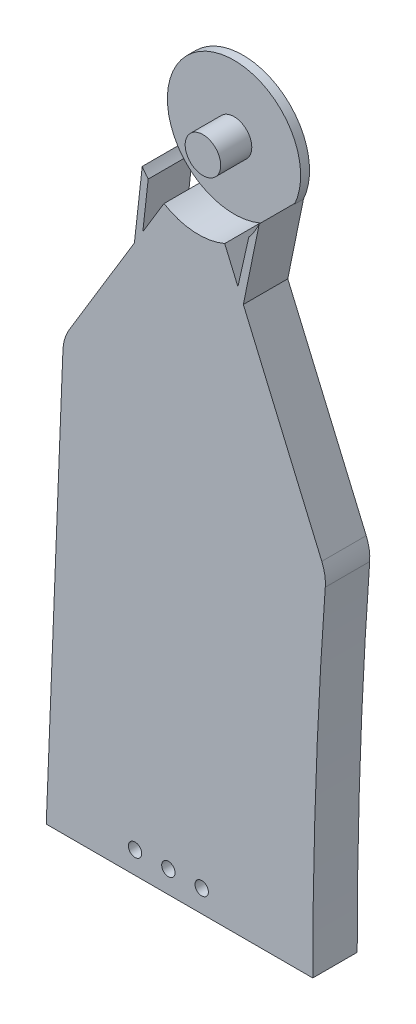
ISO-10303-21;
HEADER;
FILE_DESCRIPTION(('STEP AP214'),'2;1');
FILE_NAME('part.step','',(''),(''),'','','');
FILE_SCHEMA(('AUTOMOTIVE_DESIGN { 1 0 10303 214 1 1 1 1 }'));
ENDSEC;
DATA;
#1=APPLICATION_CONTEXT('core data for automotive mechanical design processes');
#2=APPLICATION_PROTOCOL_DEFINITION('international standard','automotive_design',2000,#1);
#3=PRODUCT_CONTEXT('',#1,'mechanical');
#4=PRODUCT('Part','Part','',(#3));
#5=PRODUCT_RELATED_PRODUCT_CATEGORY('part','',(#4));
#6=PRODUCT_DEFINITION_FORMATION('','',#4);
#7=PRODUCT_DEFINITION_CONTEXT('part definition',#1,'design');
#8=PRODUCT_DEFINITION('design','',#6,#7);
#9=PRODUCT_DEFINITION_SHAPE('','',#8);
#10=(LENGTH_UNIT() NAMED_UNIT(*) SI_UNIT(.MILLI.,.METRE.));
#11=(NAMED_UNIT(*) PLANE_ANGLE_UNIT() SI_UNIT($,.RADIAN.));
#12=(NAMED_UNIT(*) SI_UNIT($,.STERADIAN.) SOLID_ANGLE_UNIT());
#13=UNCERTAINTY_MEASURE_WITH_UNIT(LENGTH_MEASURE(1.E-05),#10,'distance_accuracy_value','');
#14=(GEOMETRIC_REPRESENTATION_CONTEXT(3) GLOBAL_UNCERTAINTY_ASSIGNED_CONTEXT((#13)) GLOBAL_UNIT_ASSIGNED_CONTEXT((#10,
#11,#12)) REPRESENTATION_CONTEXT('',''));
#15=CARTESIAN_POINT('',(0.,0.,0.));
#16=DIRECTION('',(0.,0.,1.));
#17=DIRECTION('',(1.,0.,0.));
#18=AXIS2_PLACEMENT_3D('',#15,#16,#17);
#19=CARTESIAN_POINT('',(44.2763644931734,147.051943440715,2.));
#20=DIRECTION('',(0.,0.,-1.));
#21=DIRECTION('',(-1.,0.,0.));
#22=AXIS2_PLACEMENT_3D('',#19,#20,#21);
#23=CYLINDRICAL_SURFACE('',#22,15.);
#24=DIRECTION('',(0.,0.,-1.));
#25=VECTOR('',#24,1.);
#26=CARTESIAN_POINT('',(31.6125575888967,139.012789586534,10.));
#27=LINE('',#26,#25);
#28=CARTESIAN_POINT('',(31.6125575888967,139.012789586534,2.));
#29=VERTEX_POINT('',#28);
#30=CARTESIAN_POINT('',(31.6125575888967,139.012789586534,0.));
#31=VERTEX_POINT('',#30);
#32=EDGE_CURVE('E236',#29,#31,#27,.T.);
#33=ORIENTED_EDGE('',*,*,#32,.F.);
#34=CARTESIAN_POINT('',(44.2763644931734,147.051943440715,2.));
#35=DIRECTION('',(0.,0.,-1.));
#36=DIRECTION('',(-1.,0.,0.));
#37=AXIS2_PLACEMENT_3D('',#34,#35,#36);
#38=CIRCLE('',#37,15.);
#39=CARTESIAN_POINT('',(57.9090395867184,140.794933788027,2.));
#40=VERTEX_POINT('',#39);
#41=EDGE_CURVE('E391',#29,#40,#38,.T.);
#42=ORIENTED_EDGE('',*,*,#41,.T.);
#43=DIRECTION('',(0.,0.,-1.));
#44=VECTOR('',#43,1.);
#45=CARTESIAN_POINT('',(57.9090395867184,140.794933788027,2.));
#46=LINE('',#45,#44);
#47=CARTESIAN_POINT('',(57.9090395867184,140.794933788027,0.));
#48=VERTEX_POINT('',#47);
#49=EDGE_CURVE('E381',#48,#40,#46,.F.);
#50=ORIENTED_EDGE('',*,*,#49,.F.);
#51=CARTESIAN_POINT('',(44.2763644931734,147.051943440715,0.));
#52=DIRECTION('',(0.,0.,-1.));
#53=DIRECTION('',(-1.,0.,0.));
#54=AXIS2_PLACEMENT_3D('',#51,#52,#53);
#55=CIRCLE('',#54,15.);
#56=EDGE_CURVE('E388',#31,#48,#55,.T.);
#57=ORIENTED_EDGE('',*,*,#56,.F.);
#58=EDGE_LOOP('',(#33,#42,#50,#57));
#59=FACE_BOUND('',#58,.T.);
#60=ADVANCED_FACE('F37',(#59),#23,.T.);
#61=CARTESIAN_POINT('',(44.2763644931734,147.051943440715,-96.4200600590617));
#62=DIRECTION('',(-0.855560970353565,0.517702062974126,0.));
#63=DIRECTION('',(-0.517702062974126,-0.855560970353565,0.));
#64=AXIS2_PLACEMENT_3D('',#61,#62,#63);
#65=PLANE('',#64);
#66=DIRECTION('',(0.,0.,-1.));
#67=VECTOR('',#66,1.);
#68=CARTESIAN_POINT('',(29.8522409938267,123.214454699208,10.));
#69=LINE('',#68,#67);
#70=CARTESIAN_POINT('',(29.8522409938268,123.214454699208,10.));
#71=VERTEX_POINT('',#70);
#72=CARTESIAN_POINT('',(29.8522409938267,123.214454699208,0.));
#73=VERTEX_POINT('',#72);
#74=EDGE_CURVE('E237',#71,#73,#69,.T.);
#75=ORIENTED_EDGE('',*,*,#74,.T.);
#76=DIRECTION('',(-0.517702062974126,-0.855560970353565,0.));
#77=VECTOR('',#76,1.);
#78=CARTESIAN_POINT('',(44.2763644931734,147.051943440715,0.));
#79=LINE('',#78,#77);
#80=CARTESIAN_POINT('',(15.1997311270334,98.9995317612337,0.));
#81=VERTEX_POINT('',#80);
#82=EDGE_CURVE('E311',#73,#81,#79,.T.);
#83=ORIENTED_EDGE('',*,*,#82,.T.);
#84=DIRECTION('',(0.,0.,1.));
#85=VECTOR('',#84,1.);
#86=CARTESIAN_POINT('',(15.1997311270334,98.9995317612337,9.99999999999999));
#87=LINE('',#86,#85);
#88=CARTESIAN_POINT('',(15.1997311270334,98.9995317612337,10.));
#89=VERTEX_POINT('',#88);
#90=EDGE_CURVE('E341',#81,#89,#87,.T.);
#91=ORIENTED_EDGE('',*,*,#90,.T.);
#92=DIRECTION('',(-0.517702062974126,-0.855560970353565,0.));
#93=VECTOR('',#92,1.);
#94=CARTESIAN_POINT('',(44.2763644931734,147.051943440715,10.));
#95=LINE('',#94,#93);
#96=EDGE_CURVE('E62',#71,#89,#95,.T.);
#97=ORIENTED_EDGE('',*,*,#96,.F.);
#98=EDGE_LOOP('',(#75,#83,#91,#97));
#99=FACE_BOUND('',#98,.T.);
#100=ADVANCED_FACE('F417',(#99),#65,.T.);
#101=DIRECTION('',(0.,0.,-1.));
#102=VECTOR('',#101,1.);
#103=CARTESIAN_POINT('',(50.181406214244,133.263162411472,17.));
#104=LINE('',#103,#102);
#105=CARTESIAN_POINT('',(50.181406214244,133.263162411472,2.));
#106=VERTEX_POINT('',#105);
#107=CARTESIAN_POINT('',(50.181406214244,133.263162411472,0.));
#108=VERTEX_POINT('',#107);
#109=EDGE_CURVE('E299',#106,#108,#104,.T.);
#110=ORIENTED_EDGE('',*,*,#109,.T.);
#111=CARTESIAN_POINT('',(55.5987180249591,137.213025283658,0.));
#112=VERTEX_POINT('',#111);
#113=EDGE_CURVE('E41',#112,#108,#55,.T.);
#114=ORIENTED_EDGE('',*,*,#113,.F.);
#115=DIRECTION('',(0.,0.,-1.));
#116=VECTOR('',#115,1.);
#117=CARTESIAN_POINT('',(55.5987180249591,137.213025283658,10.));
#118=LINE('',#117,#116);
#119=CARTESIAN_POINT('',(55.5987180249591,137.213025283658,2.));
#120=VERTEX_POINT('',#119);
#121=EDGE_CURVE('E371',#120,#112,#118,.T.);
#122=ORIENTED_EDGE('',*,*,#121,.F.);
#123=EDGE_CURVE('E46',#120,#106,#38,.T.);
#124=ORIENTED_EDGE('',*,*,#123,.T.);
#125=EDGE_LOOP('',(#110,#114,#122,#124));
#126=FACE_BOUND('',#125,.T.);
#127=ADVANCED_FACE('F418',(#126),#23,.T.);
#128=DIRECTION('',(0.,0.,-1.));
#129=VECTOR('',#128,1.);
#130=CARTESIAN_POINT('',(32.9540109613877,137.213025283658,10.));
#131=LINE('',#130,#129);
#132=CARTESIAN_POINT('',(32.9540109613877,137.213025283658,2.));
#133=VERTEX_POINT('',#132);
#134=CARTESIAN_POINT('',(32.9540109613877,137.213025283658,0.));
#135=VERTEX_POINT('',#134);
#136=EDGE_CURVE('E205',#133,#135,#131,.T.);
#137=ORIENTED_EDGE('',*,*,#136,.T.);
#138=CARTESIAN_POINT('',(36.5108335485615,134.218528885412,0.));
#139=VERTEX_POINT('',#138);
#140=EDGE_CURVE('E402',#139,#135,#55,.T.);
#141=ORIENTED_EDGE('',*,*,#140,.F.);
#142=DIRECTION('',(0.,0.,-1.));
#143=VECTOR('',#142,1.);
#144=CARTESIAN_POINT('',(36.5108335485615,134.218528885412,17.));
#145=LINE('',#144,#143);
#146=CARTESIAN_POINT('',(36.5108335485615,134.218528885412,2.));
#147=VERTEX_POINT('',#146);
#148=EDGE_CURVE('E329',#139,#147,#145,.F.);
#149=ORIENTED_EDGE('',*,*,#148,.T.);
#150=EDGE_CURVE('E390',#147,#133,#38,.T.);
#151=ORIENTED_EDGE('',*,*,#150,.T.);
#152=EDGE_LOOP('',(#137,#141,#149,#151));
#153=FACE_BOUND('',#152,.T.);
#154=ADVANCED_FACE('F39',(#153),#23,.T.);
#155=CARTESIAN_POINT('',(44.2763644931734,147.051943440715,2.));
#156=DIRECTION('',(0.,0.,-1.));
#157=DIRECTION('',(-1.,0.,0.));
#158=AXIS2_PLACEMENT_3D('',#155,#156,#157);
#159=PLANE('',#158);
#160=CARTESIAN_POINT('',(44.2763644931734,147.051943440715,2.));
#161=DIRECTION('',(0.,0.,1.));
#162=DIRECTION('',(1.,0.,0.));
#163=AXIS2_PLACEMENT_3D('',#160,#161,#162);
#164=CIRCLE('',#163,4.00000000000001);
#165=CARTESIAN_POINT('',(48.2763644931734,147.051943440715,2.));
#166=VERTEX_POINT('',#165);
#167=EDGE_CURVE('E11',#166,#166,#164,.T.);
#168=ORIENTED_EDGE('',*,*,#167,.F.);
#169=EDGE_LOOP('',(#168));
#170=FACE_BOUND('',#169,.T.);
#171=CARTESIAN_POINT('',(44.1902833763916,146.940189646613,2.));
#172=DIRECTION('',(0.,0.,-1.));
#173=DIRECTION('',(-1.,0.,0.));
#174=AXIS2_PLACEMENT_3D('',#171,#172,#173);
#175=CIRCLE('',#174,14.9923349640595);
#176=CARTESIAN_POINT('',(57.9467012540788,140.979394829727,2.));
#177=VERTEX_POINT('',#176);
#178=EDGE_CURVE('E384',#177,#120,#175,.T.);
#179=ORIENTED_EDGE('',*,*,#178,.F.);
#180=DIRECTION('',(-0.2000444383888,-0.979786825115397,0.));
#181=VECTOR('',#180,1.);
#182=CARTESIAN_POINT('',(58.5898697859991,144.129535163444,2.));
#183=LINE('',#182,#181);
#184=EDGE_CURVE('E370',#177,#40,#183,.T.);
#185=ORIENTED_EDGE('',*,*,#184,.T.);
#186=ORIENTED_EDGE('',*,*,#41,.F.);
#187=CARTESIAN_POINT('',(44.2763645215605,147.051943461874,2.));
#188=DIRECTION('',(0.,0.,-1.));
#189=DIRECTION('',(-1.,0.,0.));
#190=AXIS2_PLACEMENT_3D('',#187,#188,#189);
#191=CIRCLE('',#190,15.0000000353057);
#192=EDGE_CURVE('E235',#133,#29,#191,.T.);
#193=ORIENTED_EDGE('',*,*,#192,.F.);
#194=ORIENTED_EDGE('',*,*,#150,.F.);
#195=CARTESIAN_POINT('',(44.2763644931734,147.051943440715,2.));
#196=DIRECTION('',(0.,0.,-1.));
#197=DIRECTION('',(-1.,0.,0.));
#198=AXIS2_PLACEMENT_3D('',#195,#196,#197);
#199=CIRCLE('',#198,15.);
#200=EDGE_CURVE('E350',#106,#147,#199,.T.);
#201=ORIENTED_EDGE('',*,*,#200,.F.);
#202=ORIENTED_EDGE('',*,*,#123,.F.);
#203=EDGE_LOOP('',(#179,#185,#186,#193,#194,#201,#202));
#204=FACE_BOUND('',#203,.T.);
#205=ADVANCED_FACE('F427',(#170,#204),#159,.F.);
#206=CARTESIAN_POINT('',(44.2763644931734,147.051943440715,0.));
#207=DIRECTION('',(0.,0.,-1.));
#208=DIRECTION('',(-1.,0.,0.));
#209=AXIS2_PLACEMENT_3D('',#206,#207,#208);
#210=PLANE('',#209);
#211=DIRECTION('',(0.11073887500805,0.993849536681459,0.));
#212=VECTOR('',#211,1.);
#213=CARTESIAN_POINT('',(15.925450722716,-1.77448037347624,0.));
#214=LINE('',#213,#212);
#215=EDGE_CURVE('E54',#73,#31,#214,.T.);
#216=ORIENTED_EDGE('',*,*,#215,.T.);
#217=ORIENTED_EDGE('',*,*,#56,.T.);
#218=DIRECTION('',(-0.2000444383888,-0.979786825115397,0.));
#219=VECTOR('',#218,1.);
#220=CARTESIAN_POINT('',(27.9957140691882,-5.71592386701525,0.));
#221=LINE('',#220,#219);
#222=CARTESIAN_POINT('',(54.3729271344953,123.475600040387,0.));
#223=VERTEX_POINT('',#222);
#224=EDGE_CURVE('E352',#48,#223,#221,.T.);
#225=ORIENTED_EDGE('',*,*,#224,.T.);
#226=DIRECTION('',(-0.393669448071373,0.91925206861621,0.));
#227=VECTOR('',#226,1.);
#228=CARTESIAN_POINT('',(44.2763644931734,147.051943440715,0.));
#229=LINE('',#228,#227);
#230=CARTESIAN_POINT('',(72.0316506726399,82.2409596051503,0.));
#231=VERTEX_POINT('',#230);
#232=EDGE_CURVE('E312',#231,#223,#229,.T.);
#233=ORIENTED_EDGE('',*,*,#232,.F.);
#234=CARTESIAN_POINT('',(62.8391299864779,78.3042651244366,0.));
#235=DIRECTION('',(0.,0.,-1.));
#236=DIRECTION('',(-1.,0.,0.));
#237=AXIS2_PLACEMENT_3D('',#234,#235,#236);
#238=CIRCLE('',#237,10.);
#239=CARTESIAN_POINT('',(72.8128721368919,77.5800638284881,0.));
#240=VERTEX_POINT('',#239);
#241=EDGE_CURVE('E332',#231,#240,#238,.T.);
#242=ORIENTED_EDGE('',*,*,#241,.T.);
#243=CARTESIAN_POINT('',(1141.25,0.,0.));
#244=DIRECTION('',(0.,0.,-1.));
#245=DIRECTION('',(-1.,0.,0.));
#246=AXIS2_PLACEMENT_3D('',#243,#244,#245);
#247=CIRCLE('',#246,1071.25);
#248=CARTESIAN_POINT('',(70.,0.,0.));
#249=VERTEX_POINT('',#248);
#250=EDGE_CURVE('E317',#249,#240,#247,.T.);
#251=ORIENTED_EDGE('',*,*,#250,.F.);
#252=DIRECTION('',(1.,0.,0.));
#253=VECTOR('',#252,1.);
#254=CARTESIAN_POINT('',(0.,0.,0.));
#255=LINE('',#254,#253);
#256=CARTESIAN_POINT('',(50.,0.,0.));
#257=VERTEX_POINT('',#256);
#258=EDGE_CURVE('E310',#257,#249,#255,.T.);
#259=ORIENTED_EDGE('',*,*,#258,.F.);
#260=DIRECTION('',(0.,-1.,0.));
#261=VECTOR('',#260,1.);
#262=CARTESIAN_POINT('',(50.,0.,0.));
#263=LINE('',#262,#261);
#264=CARTESIAN_POINT('',(50.,10.,0.));
#265=VERTEX_POINT('',#264);
#266=EDGE_CURVE('E259',#265,#257,#263,.T.);
#267=ORIENTED_EDGE('',*,*,#266,.F.);
#268=DIRECTION('',(1.,0.,0.));
#269=VECTOR('',#268,1.);
#270=CARTESIAN_POINT('',(50.,10.,0.));
#271=LINE('',#270,#269);
#272=CARTESIAN_POINT('',(25.,10.,0.));
#273=VERTEX_POINT('',#272);
#274=EDGE_CURVE('E264',#273,#265,#271,.T.);
#275=ORIENTED_EDGE('',*,*,#274,.F.);
#276=DIRECTION('',(0.,1.,0.));
#277=VECTOR('',#276,1.);
#278=CARTESIAN_POINT('',(25.,0.,0.));
#279=LINE('',#278,#277);
#280=CARTESIAN_POINT('',(25.,0.,0.));
#281=VERTEX_POINT('',#280);
#282=EDGE_CURVE('E275',#281,#273,#279,.T.);
#283=ORIENTED_EDGE('',*,*,#282,.F.);
#284=CARTESIAN_POINT('',(10.0079396555768,0.,0.));
#285=VERTEX_POINT('',#284);
#286=EDGE_CURVE('E321',#285,#281,#255,.T.);
#287=ORIENTED_EDGE('',*,*,#286,.F.);
#288=DIRECTION('',(0.0398251424537612,0.999206664323521,0.));
#289=VECTOR('',#288,1.);
#290=CARTESIAN_POINT('',(13.8658828164649,96.7951971902288,0.));
#291=LINE('',#290,#289);
#292=CARTESIAN_POINT('',(13.7632741873339,94.2207625560301,0.));
#293=VERTEX_POINT('',#292);
#294=EDGE_CURVE('E289',#285,#293,#291,.T.);
#295=ORIENTED_EDGE('',*,*,#294,.T.);
#296=CARTESIAN_POINT('',(23.7553408305691,93.8225111314924,0.));
#297=DIRECTION('',(0.,0.,-1.));
#298=DIRECTION('',(-1.,0.,0.));
#299=AXIS2_PLACEMENT_3D('',#296,#297,#298);
#300=CIRCLE('',#299,10.);
#301=EDGE_CURVE('E347',#293,#81,#300,.T.);
#302=ORIENTED_EDGE('',*,*,#301,.T.);
#303=ORIENTED_EDGE('',*,*,#82,.F.);
#304=EDGE_LOOP('',(#216,#217,#225,#233,#242,#251,#259,#267,#275,#283,#287,#295,#302,#303));
#305=FACE_BOUND('',#304,.T.);
#306=CARTESIAN_POINT('',(31.7422620331581,126.33792734892,0.));
#307=VERTEX_POINT('',#306);
#308=EDGE_CURVE('E308',#139,#307,#79,.T.);
#309=ORIENTED_EDGE('',*,*,#308,.F.);
#310=ORIENTED_EDGE('',*,*,#140,.T.);
#311=DIRECTION('',(-0.11073887500805,-0.993849536681459,0.));
#312=VECTOR('',#311,1.);
#313=CARTESIAN_POINT('',(17.4485317834629,-1.94418843992699,0.));
#314=LINE('',#313,#312);
#315=EDGE_CURVE('E230',#135,#307,#314,.T.);
#316=ORIENTED_EDGE('',*,*,#315,.T.);
#317=EDGE_LOOP('',(#309,#310,#316));
#318=FACE_BOUND('',#317,.T.);
#319=ORIENTED_EDGE('',*,*,#113,.T.);
#320=CARTESIAN_POINT('',(53.1471362440316,126.33792734892,0.));
#321=VERTEX_POINT('',#320);
#322=EDGE_CURVE('E305',#321,#108,#229,.T.);
#323=ORIENTED_EDGE('',*,*,#322,.F.);
#324=DIRECTION('',(-0.219912159311145,-0.975519678011218,0.));
#325=VECTOR('',#324,1.);
#326=CARTESIAN_POINT('',(23.4737649831254,-5.29170908692022,0.));
#327=LINE('',#326,#325);
#328=EDGE_CURVE('E356',#112,#321,#327,.T.);
#329=ORIENTED_EDGE('',*,*,#328,.F.);
#330=EDGE_LOOP('',(#319,#323,#329));
#331=FACE_BOUND('',#330,.T.);
#332=ADVANCED_FACE('F410',(#305,#318,#331),#210,.T.);
#333=CARTESIAN_POINT('',(44.2763644931734,147.051943440715,9.));
#334=DIRECTION('',(0.,0.,-1.));
#335=DIRECTION('',(-1.,0.,0.));
#336=AXIS2_PLACEMENT_3D('',#333,#334,#335);
#337=CYLINDRICAL_SURFACE('',#336,4.00000000000001);
#338=CARTESIAN_POINT('',(44.2763644931734,147.051943440715,9.));
#339=DIRECTION('',(0.,0.,1.));
#340=DIRECTION('',(1.,0.,0.));
#341=AXIS2_PLACEMENT_3D('',#338,#339,#340);
#342=CIRCLE('',#341,4.00000000000001);
#343=CARTESIAN_POINT('',(48.2763644931734,147.051943440715,9.));
#344=VERTEX_POINT('',#343);
#345=EDGE_CURVE('E386',#344,#344,#342,.T.);
#346=ORIENTED_EDGE('',*,*,#345,.F.);
#347=EDGE_LOOP('',(#346));
#348=FACE_BOUND('',#347,.T.);
#349=ORIENTED_EDGE('',*,*,#167,.T.);
#350=EDGE_LOOP('',(#349));
#351=FACE_BOUND('',#350,.T.);
#352=ADVANCED_FACE('F532',(#348,#351),#337,.T.);
#353=CARTESIAN_POINT('',(44.2763644931734,147.051943440715,9.));
#354=DIRECTION('',(0.,0.,1.));
#355=DIRECTION('',(1.,0.,0.));
#356=AXIS2_PLACEMENT_3D('',#353,#354,#355);
#357=PLANE('',#356);
#358=ORIENTED_EDGE('',*,*,#345,.T.);
#359=EDGE_LOOP('',(#358));
#360=FACE_BOUND('',#359,.T.);
#361=ADVANCED_FACE('F528',(#360),#357,.T.);
#362=CARTESIAN_POINT('',(44.1902833763916,146.940189646613,10.));
#363=DIRECTION('',(0.,0.,-1.));
#364=DIRECTION('',(-1.,0.,0.));
#365=AXIS2_PLACEMENT_3D('',#362,#363,#364);
#366=CYLINDRICAL_SURFACE('',#365,14.9923349640595);
#367=DIRECTION('',(0.,0.,-1.));
#368=VECTOR('',#367,1.);
#369=CARTESIAN_POINT('',(57.9467012540788,140.979394829727,10.));
#370=LINE('',#369,#368);
#371=CARTESIAN_POINT('',(57.9467012540788,140.979394829727,10.));
#372=VERTEX_POINT('',#371);
#373=EDGE_CURVE('E362',#372,#177,#370,.T.);
#374=ORIENTED_EDGE('',*,*,#373,.T.);
#375=ORIENTED_EDGE('',*,*,#178,.T.);
#376=CARTESIAN_POINT('',(55.5987180249591,137.213025283658,10.));
#377=VERTEX_POINT('',#376);
#378=EDGE_CURVE('E367',#377,#120,#118,.T.);
#379=ORIENTED_EDGE('',*,*,#378,.F.);
#380=CARTESIAN_POINT('',(44.1902833763916,146.940189646613,10.));
#381=DIRECTION('',(0.,0.,-1.));
#382=DIRECTION('',(-1.,0.,0.));
#383=AXIS2_PLACEMENT_3D('',#380,#381,#382);
#384=CIRCLE('',#383,14.9923349640595);
#385=EDGE_CURVE('E353',#372,#377,#384,.T.);
#386=ORIENTED_EDGE('',*,*,#385,.F.);
#387=EDGE_LOOP('',(#374,#375,#379,#386));
#388=FACE_BOUND('',#387,.T.);
#389=ADVANCED_FACE('F522',(#388),#366,.F.);
#390=CARTESIAN_POINT('',(23.4737649831254,-5.29170908692022,10.));
#391=DIRECTION('',(0.975519678011218,-0.219912159311145,0.));
#392=DIRECTION('',(0.219912159311145,0.975519678011218,0.));
#393=AXIS2_PLACEMENT_3D('',#390,#391,#392);
#394=PLANE('',#393);
#395=ORIENTED_EDGE('',*,*,#328,.T.);
#396=DIRECTION('',(0.,0.,-1.));
#397=VECTOR('',#396,1.);
#398=CARTESIAN_POINT('',(53.1471362440316,126.33792734892,10.));
#399=LINE('',#398,#397);
#400=CARTESIAN_POINT('',(53.1471362440316,126.33792734892,10.));
#401=VERTEX_POINT('',#400);
#402=EDGE_CURVE('E372',#401,#321,#399,.T.);
#403=ORIENTED_EDGE('',*,*,#402,.F.);
#404=DIRECTION('',(-0.219912159311145,-0.975519678011218,0.));
#405=VECTOR('',#404,1.);
#406=CARTESIAN_POINT('',(23.4737649831254,-5.29170908692022,10.));
#407=LINE('',#406,#405);
#408=EDGE_CURVE('E359',#377,#401,#407,.T.);
#409=ORIENTED_EDGE('',*,*,#408,.F.);
#410=ORIENTED_EDGE('',*,*,#378,.T.);
#411=ORIENTED_EDGE('',*,*,#121,.T.);
#412=EDGE_LOOP('',(#395,#403,#409,#410,#411));
#413=FACE_BOUND('',#412,.T.);
#414=ADVANCED_FACE('F519',(#413),#394,.F.);
#415=CARTESIAN_POINT('',(27.9957140691882,-5.71592386701525,10.));
#416=DIRECTION('',(0.979786825115397,-0.2000444383888,0.));
#417=DIRECTION('',(0.2000444383888,0.979786825115397,0.));
#418=AXIS2_PLACEMENT_3D('',#415,#416,#417);
#419=PLANE('',#418);
#420=ORIENTED_EDGE('',*,*,#224,.F.);
#421=ORIENTED_EDGE('',*,*,#49,.T.);
#422=ORIENTED_EDGE('',*,*,#184,.F.);
#423=ORIENTED_EDGE('',*,*,#373,.F.);
#424=DIRECTION('',(-0.2000444383888,-0.979786825115397,0.));
#425=VECTOR('',#424,1.);
#426=CARTESIAN_POINT('',(27.9957140691882,-5.71592386701525,10.));
#427=LINE('',#426,#425);
#428=CARTESIAN_POINT('',(54.3729271344953,123.475600040387,10.));
#429=VERTEX_POINT('',#428);
#430=EDGE_CURVE('E355',#372,#429,#427,.T.);
#431=ORIENTED_EDGE('',*,*,#430,.T.);
#432=DIRECTION('',(0.,0.,-1.));
#433=VECTOR('',#432,1.);
#434=CARTESIAN_POINT('',(54.3729271344953,123.475600040387,10.));
#435=LINE('',#434,#433);
#436=EDGE_CURVE('E374',#429,#223,#435,.T.);
#437=ORIENTED_EDGE('',*,*,#436,.T.);
#438=EDGE_LOOP('',(#420,#421,#422,#423,#431,#437));
#439=FACE_BOUND('',#438,.T.);
#440=ADVANCED_FACE('F414',(#439),#419,.T.);
#441=CARTESIAN_POINT('',(0.,0.,10.));
#442=DIRECTION('',(0.,0.,-1.));
#443=DIRECTION('',(-1.,0.,0.));
#444=AXIS2_PLACEMENT_3D('',#441,#442,#443);
#445=PLANE('',#444);
#446=ORIENTED_EDGE('',*,*,#385,.T.);
#447=ORIENTED_EDGE('',*,*,#408,.T.);
#448=DIRECTION('',(-0.393669448071373,0.91925206861621,0.));
#449=VECTOR('',#448,1.);
#450=CARTESIAN_POINT('',(44.2763644931734,147.051943440715,10.));
#451=LINE('',#450,#449);
#452=CARTESIAN_POINT('',(50.181406214244,133.263162411472,10.));
#453=VERTEX_POINT('',#452);
#454=EDGE_CURVE('E306',#401,#453,#451,.T.);
#455=ORIENTED_EDGE('',*,*,#454,.T.);
#456=CARTESIAN_POINT('',(44.2763644931734,147.051943440715,10.));
#457=DIRECTION('',(0.,0.,-1.));
#458=DIRECTION('',(-1.,0.,0.));
#459=AXIS2_PLACEMENT_3D('',#456,#457,#458);
#460=CIRCLE('',#459,15.);
#461=CARTESIAN_POINT('',(36.5108335485615,134.218528885412,10.));
#462=VERTEX_POINT('',#461);
#463=EDGE_CURVE('E297',#453,#462,#460,.T.);
#464=ORIENTED_EDGE('',*,*,#463,.T.);
#465=CARTESIAN_POINT('',(31.742262033158,126.33792734892,10.));
#466=VERTEX_POINT('',#465);
#467=EDGE_CURVE('E225',#462,#466,#95,.T.);
#468=ORIENTED_EDGE('',*,*,#467,.T.);
#469=DIRECTION('',(-0.11073887500805,-0.993849536681459,0.));
#470=VECTOR('',#469,1.);
#471=CARTESIAN_POINT('',(17.4485317834629,-1.94418843992699,10.));
#472=LINE('',#471,#470);
#473=CARTESIAN_POINT('',(32.9540109613877,137.213025283658,10.));
#474=VERTEX_POINT('',#473);
#475=EDGE_CURVE('E203',#474,#466,#472,.T.);
#476=ORIENTED_EDGE('',*,*,#475,.F.);
#477=CARTESIAN_POINT('',(44.2763645215605,147.051943461874,10.));
#478=DIRECTION('',(0.,0.,-1.));
#479=DIRECTION('',(-1.,0.,0.));
#480=AXIS2_PLACEMENT_3D('',#477,#478,#479);
#481=CIRCLE('',#480,15.0000000353057);
#482=CARTESIAN_POINT('',(31.6125575888967,139.012789586534,10.));
#483=VERTEX_POINT('',#482);
#484=EDGE_CURVE('E211',#474,#483,#481,.T.);
#485=ORIENTED_EDGE('',*,*,#484,.T.);
#486=DIRECTION('',(0.11073887500805,0.993849536681459,0.));
#487=VECTOR('',#486,1.);
#488=CARTESIAN_POINT('',(15.925450722716,-1.77448037347624,10.));
#489=LINE('',#488,#487);
#490=EDGE_CURVE('E226',#71,#483,#489,.T.);
#491=ORIENTED_EDGE('',*,*,#490,.F.);
#492=ORIENTED_EDGE('',*,*,#96,.T.);
#493=CARTESIAN_POINT('',(23.7553408305691,93.8225111314924,9.99999999999999));
#494=DIRECTION('',(0.,0.,-1.));
#495=DIRECTION('',(-1.,0.,0.));
#496=AXIS2_PLACEMENT_3D('',#493,#494,#495);
#497=CIRCLE('',#496,10.);
#498=CARTESIAN_POINT('',(13.7632741873339,94.2207625560301,10.));
#499=VERTEX_POINT('',#498);
#500=EDGE_CURVE('E343',#89,#499,#497,.F.);
#501=ORIENTED_EDGE('',*,*,#500,.T.);
#502=DIRECTION('',(0.0398251424537612,0.999206664323521,0.));
#503=VECTOR('',#502,1.);
#504=CARTESIAN_POINT('',(13.8658828164649,96.7951971902288,10.));
#505=LINE('',#504,#503);
#506=CARTESIAN_POINT('',(10.0079396555768,0.,10.));
#507=VERTEX_POINT('',#506);
#508=EDGE_CURVE('E282',#507,#499,#505,.T.);
#509=ORIENTED_EDGE('',*,*,#508,.F.);
#510=DIRECTION('',(1.,0.,0.));
#511=VECTOR('',#510,1.);
#512=CARTESIAN_POINT('',(0.,0.,10.));
#513=LINE('',#512,#511);
#514=CARTESIAN_POINT('',(70.,0.,10.));
#515=VERTEX_POINT('',#514);
#516=EDGE_CURVE('E314',#507,#515,#513,.T.);
#517=ORIENTED_EDGE('',*,*,#516,.T.);
#518=CARTESIAN_POINT('',(1141.25,0.,10.));
#519=DIRECTION('',(0.,0.,-1.));
#520=DIRECTION('',(-1.,0.,0.));
#521=AXIS2_PLACEMENT_3D('',#518,#519,#520);
#522=CIRCLE('',#521,1071.25);
#523=CARTESIAN_POINT('',(72.8128721368919,77.5800638284881,10.));
#524=VERTEX_POINT('',#523);
#525=EDGE_CURVE('E316',#515,#524,#522,.T.);
#526=ORIENTED_EDGE('',*,*,#525,.T.);
#527=CARTESIAN_POINT('',(62.8391299864779,78.3042651244366,10.));
#528=DIRECTION('',(0.,0.,-1.));
#529=DIRECTION('',(-1.,0.,0.));
#530=AXIS2_PLACEMENT_3D('',#527,#528,#529);
#531=CIRCLE('',#530,10.);
#532=CARTESIAN_POINT('',(72.0316506726399,82.2409596051503,10.));
#533=VERTEX_POINT('',#532);
#534=EDGE_CURVE('E334',#524,#533,#531,.F.);
#535=ORIENTED_EDGE('',*,*,#534,.T.);
#536=EDGE_CURVE('E303',#533,#429,#451,.T.);
#537=ORIENTED_EDGE('',*,*,#536,.T.);
#538=ORIENTED_EDGE('',*,*,#430,.F.);
#539=EDGE_LOOP('',(#446,#447,#455,#464,#468,#476,#485,#491,#492,#501,#509,#517,#526,#535,#537,#538));
#540=FACE_BOUND('',#539,.T.);
#541=CARTESIAN_POINT('',(45.,5.,10.));
#542=DIRECTION('',(0.,0.,-1.));
#543=DIRECTION('',(-1.,0.,0.));
#544=AXIS2_PLACEMENT_3D('',#541,#542,#543);
#545=CIRCLE('',#544,1.505);
#546=CARTESIAN_POINT('',(43.495,5.,10.));
#547=VERTEX_POINT('',#546);
#548=EDGE_CURVE('E256',#547,#547,#545,.T.);
#549=ORIENTED_EDGE('',*,*,#548,.T.);
#550=EDGE_LOOP('',(#549));
#551=FACE_BOUND('',#550,.T.);
#552=CARTESIAN_POINT('',(37.5,5.,10.));
#553=DIRECTION('',(0.,0.,-1.));
#554=DIRECTION('',(-1.,0.,0.));
#555=AXIS2_PLACEMENT_3D('',#552,#553,#554);
#556=CIRCLE('',#555,1.505);
#557=CARTESIAN_POINT('',(35.995,5.,10.));
#558=VERTEX_POINT('',#557);
#559=EDGE_CURVE('E253',#558,#558,#556,.T.);
#560=ORIENTED_EDGE('',*,*,#559,.T.);
#561=EDGE_LOOP('',(#560));
#562=FACE_BOUND('',#561,.T.);
#563=CARTESIAN_POINT('',(30.,5.,10.));
#564=DIRECTION('',(0.,0.,-1.));
#565=DIRECTION('',(-1.,0.,0.));
#566=AXIS2_PLACEMENT_3D('',#563,#564,#565);
#567=CIRCLE('',#566,1.505);
#568=CARTESIAN_POINT('',(28.495,5.,10.));
#569=VERTEX_POINT('',#568);
#570=EDGE_CURVE('E245',#569,#569,#567,.T.);
#571=ORIENTED_EDGE('',*,*,#570,.T.);
#572=EDGE_LOOP('',(#571));
#573=FACE_BOUND('',#572,.T.);
#574=ADVANCED_FACE('F221',(#540,#551,#562,#573),#445,.F.);
#575=CARTESIAN_POINT('',(44.2763644931734,147.051943440715,17.));
#576=DIRECTION('',(0.,0.,-1.));
#577=DIRECTION('',(-1.,0.,0.));
#578=AXIS2_PLACEMENT_3D('',#575,#576,#577);
#579=CYLINDRICAL_SURFACE('',#578,15.);
#580=EDGE_CURVE('E300',#453,#106,#104,.T.);
#581=ORIENTED_EDGE('',*,*,#580,.T.);
#582=ORIENTED_EDGE('',*,*,#200,.T.);
#583=EDGE_CURVE('E328',#147,#462,#145,.F.);
#584=ORIENTED_EDGE('',*,*,#583,.T.);
#585=ORIENTED_EDGE('',*,*,#463,.F.);
#586=EDGE_LOOP('',(#581,#582,#584,#585));
#587=FACE_BOUND('',#586,.T.);
#588=ADVANCED_FACE('F501',(#587),#579,.F.);
#589=CARTESIAN_POINT('',(44.2763644931734,147.051943440715,-96.4200600590617));
#590=DIRECTION('',(0.91925206861621,0.393669448071373,0.));
#591=DIRECTION('',(-0.393669448071373,0.91925206861621,0.));
#592=AXIS2_PLACEMENT_3D('',#589,#590,#591);
#593=PLANE('',#592);
#594=ORIENTED_EDGE('',*,*,#402,.T.);
#595=ORIENTED_EDGE('',*,*,#322,.T.);
#596=ORIENTED_EDGE('',*,*,#109,.F.);
#597=ORIENTED_EDGE('',*,*,#580,.F.);
#598=ORIENTED_EDGE('',*,*,#454,.F.);
#599=EDGE_LOOP('',(#594,#595,#596,#597,#598));
#600=FACE_BOUND('',#599,.T.);
#601=ADVANCED_FACE('F503',(#600),#593,.T.);
#602=CARTESIAN_POINT('',(0.,0.,10.));
#603=DIRECTION('',(0.,1.,0.));
#604=DIRECTION('',(0.,0.,1.));
#605=AXIS2_PLACEMENT_3D('',#602,#603,#604);
#606=PLANE('',#605);
#607=DIRECTION('',(-1.,0.,0.));
#608=VECTOR('',#607,1.);
#609=CARTESIAN_POINT('',(50.,0.,5.));
#610=LINE('',#609,#608);
#611=CARTESIAN_POINT('',(50.,0.,5.));
#612=VERTEX_POINT('',#611);
#613=CARTESIAN_POINT('',(25.,0.,5.));
#614=VERTEX_POINT('',#613);
#615=EDGE_CURVE('E263',#612,#614,#610,.T.);
#616=ORIENTED_EDGE('',*,*,#615,.F.);
#617=DIRECTION('',(0.,0.,-1.));
#618=VECTOR('',#617,1.);
#619=CARTESIAN_POINT('',(50.,0.,5.));
#620=LINE('',#619,#618);
#621=EDGE_CURVE('E273',#612,#257,#620,.T.);
#622=ORIENTED_EDGE('',*,*,#621,.T.);
#623=ORIENTED_EDGE('',*,*,#258,.T.);
#624=DIRECTION('',(0.,0.,-1.));
#625=VECTOR('',#624,1.);
#626=CARTESIAN_POINT('',(70.,0.,10.));
#627=LINE('',#626,#625);
#628=EDGE_CURVE('E320',#515,#249,#627,.T.);
#629=ORIENTED_EDGE('',*,*,#628,.F.);
#630=ORIENTED_EDGE('',*,*,#516,.F.);
#631=DIRECTION('',(0.,0.,-1.));
#632=VECTOR('',#631,1.);
#633=CARTESIAN_POINT('',(10.0079396555768,0.,10.));
#634=LINE('',#633,#632);
#635=EDGE_CURVE('E292',#507,#285,#634,.T.);
#636=ORIENTED_EDGE('',*,*,#635,.T.);
#637=ORIENTED_EDGE('',*,*,#286,.T.);
#638=DIRECTION('',(0.,0.,-1.));
#639=VECTOR('',#638,1.);
#640=CARTESIAN_POINT('',(25.,0.,5.));
#641=LINE('',#640,#639);
#642=EDGE_CURVE('E285',#614,#281,#641,.T.);
#643=ORIENTED_EDGE('',*,*,#642,.F.);
#644=EDGE_LOOP('',(#616,#622,#623,#629,#630,#636,#637,#643));
#645=FACE_BOUND('',#644,.T.);
#646=ADVANCED_FACE('F458',(#645),#606,.F.);
#647=CARTESIAN_POINT('',(1141.25,0.,10.));
#648=DIRECTION('',(0.,0.,-1.));
#649=DIRECTION('',(-1.,0.,0.));
#650=AXIS2_PLACEMENT_3D('',#647,#648,#649);
#651=CYLINDRICAL_SURFACE('',#650,1071.25);
#652=ORIENTED_EDGE('',*,*,#250,.T.);
#653=DIRECTION('',(0.,0.,-1.));
#654=VECTOR('',#653,1.);
#655=CARTESIAN_POINT('',(72.8128721368917,77.5800638284881,10.));
#656=LINE('',#655,#654);
#657=EDGE_CURVE('E336',#240,#524,#656,.F.);
#658=ORIENTED_EDGE('',*,*,#657,.T.);
#659=ORIENTED_EDGE('',*,*,#525,.F.);
#660=ORIENTED_EDGE('',*,*,#628,.T.);
#661=EDGE_LOOP('',(#652,#658,#659,#660));
#662=FACE_BOUND('',#661,.T.);
#663=ADVANCED_FACE('F464',(#662),#651,.F.);
#664=ORIENTED_EDGE('',*,*,#232,.T.);
#665=ORIENTED_EDGE('',*,*,#436,.F.);
#666=ORIENTED_EDGE('',*,*,#536,.F.);
#667=DIRECTION('',(0.,0.,1.));
#668=VECTOR('',#667,1.);
#669=CARTESIAN_POINT('',(72.0316506726399,82.2409596051503,0.));
#670=LINE('',#669,#668);
#671=EDGE_CURVE('E339',#533,#231,#670,.F.);
#672=ORIENTED_EDGE('',*,*,#671,.T.);
#673=EDGE_LOOP('',(#664,#665,#666,#672));
#674=FACE_BOUND('',#673,.T.);
#675=ADVANCED_FACE('F472',(#674),#593,.T.);
#676=DIRECTION('',(0.,0.,-1.));
#677=VECTOR('',#676,1.);
#678=CARTESIAN_POINT('',(31.7422620331581,126.33792734892,10.));
#679=LINE('',#678,#677);
#680=EDGE_CURVE('E208',#466,#307,#679,.T.);
#681=ORIENTED_EDGE('',*,*,#680,.F.);
#682=ORIENTED_EDGE('',*,*,#467,.F.);
#683=ORIENTED_EDGE('',*,*,#583,.F.);
#684=ORIENTED_EDGE('',*,*,#148,.F.);
#685=ORIENTED_EDGE('',*,*,#308,.T.);
#686=EDGE_LOOP('',(#681,#682,#683,#684,#685));
#687=FACE_BOUND('',#686,.T.);
#688=ADVANCED_FACE('F424',(#687),#65,.T.);
#689=CARTESIAN_POINT('',(62.8391299864779,78.3042651244366,10.));
#690=DIRECTION('',(0.,0.,-1.));
#691=DIRECTION('',(-1.,0.,0.));
#692=AXIS2_PLACEMENT_3D('',#689,#690,#691);
#693=CYLINDRICAL_SURFACE('',#692,10.);
#694=ORIENTED_EDGE('',*,*,#241,.F.);
#695=ORIENTED_EDGE('',*,*,#671,.F.);
#696=ORIENTED_EDGE('',*,*,#534,.F.);
#697=ORIENTED_EDGE('',*,*,#657,.F.);
#698=EDGE_LOOP('',(#694,#695,#696,#697));
#699=FACE_BOUND('',#698,.T.);
#700=ADVANCED_FACE('F469',(#699),#693,.T.);
#701=CARTESIAN_POINT('',(13.8658828164649,96.7951971902288,0.));
#702=DIRECTION('',(0.999206664323521,-0.0398251424537612,0.));
#703=DIRECTION('',(0.0398251424537612,0.999206664323521,0.));
#704=AXIS2_PLACEMENT_3D('',#701,#702,#703);
#705=PLANE('',#704);
#706=ORIENTED_EDGE('',*,*,#508,.T.);
#707=DIRECTION('',(0.,0.,1.));
#708=VECTOR('',#707,1.);
#709=CARTESIAN_POINT('',(13.7632741873339,94.2207625560301,0.));
#710=LINE('',#709,#708);
#711=EDGE_CURVE('E345',#499,#293,#710,.F.);
#712=ORIENTED_EDGE('',*,*,#711,.T.);
#713=ORIENTED_EDGE('',*,*,#294,.F.);
#714=ORIENTED_EDGE('',*,*,#635,.F.);
#715=EDGE_LOOP('',(#706,#712,#713,#714));
#716=FACE_BOUND('',#715,.T.);
#717=ADVANCED_FACE('F454',(#716),#705,.F.);
#718=CARTESIAN_POINT('',(23.7553408305691,93.8225111314924,-96.4200600590617));
#719=DIRECTION('',(0.,0.,-1.));
#720=DIRECTION('',(-1.,0.,0.));
#721=AXIS2_PLACEMENT_3D('',#718,#719,#720);
#722=CYLINDRICAL_SURFACE('',#721,10.);
#723=ORIENTED_EDGE('',*,*,#301,.F.);
#724=ORIENTED_EDGE('',*,*,#711,.F.);
#725=ORIENTED_EDGE('',*,*,#500,.F.);
#726=ORIENTED_EDGE('',*,*,#90,.F.);
#727=EDGE_LOOP('',(#723,#724,#725,#726));
#728=FACE_BOUND('',#727,.T.);
#729=ADVANCED_FACE('F450',(#728),#722,.T.);
#730=CARTESIAN_POINT('',(50.,0.,5.));
#731=DIRECTION('',(1.,0.,0.));
#732=DIRECTION('',(0.,0.,-1.));
#733=AXIS2_PLACEMENT_3D('',#730,#731,#732);
#734=PLANE('',#733);
#735=ORIENTED_EDGE('',*,*,#266,.T.);
#736=ORIENTED_EDGE('',*,*,#621,.F.);
#737=DIRECTION('',(0.,-1.,0.));
#738=VECTOR('',#737,1.);
#739=CARTESIAN_POINT('',(50.,0.,5.));
#740=LINE('',#739,#738);
#741=CARTESIAN_POINT('',(50.,10.,5.));
#742=VERTEX_POINT('',#741);
#743=EDGE_CURVE('E260',#742,#612,#740,.T.);
#744=ORIENTED_EDGE('',*,*,#743,.F.);
#745=DIRECTION('',(0.,0.,-1.));
#746=VECTOR('',#745,1.);
#747=CARTESIAN_POINT('',(50.,10.,5.));
#748=LINE('',#747,#746);
#749=EDGE_CURVE('E280',#742,#265,#748,.T.);
#750=ORIENTED_EDGE('',*,*,#749,.T.);
#751=EDGE_LOOP('',(#735,#736,#744,#750));
#752=FACE_BOUND('',#751,.T.);
#753=ADVANCED_FACE('F478',(#752),#734,.F.);
#754=CARTESIAN_POINT('',(50.,10.,5.));
#755=DIRECTION('',(0.,1.,0.));
#756=DIRECTION('',(0.,0.,1.));
#757=AXIS2_PLACEMENT_3D('',#754,#755,#756);
#758=PLANE('',#757);
#759=ORIENTED_EDGE('',*,*,#274,.T.);
#760=ORIENTED_EDGE('',*,*,#749,.F.);
#761=DIRECTION('',(1.,0.,0.));
#762=VECTOR('',#761,1.);
#763=CARTESIAN_POINT('',(50.,10.,5.));
#764=LINE('',#763,#762);
#765=CARTESIAN_POINT('',(25.,10.,5.));
#766=VERTEX_POINT('',#765);
#767=EDGE_CURVE('E270',#766,#742,#764,.T.);
#768=ORIENTED_EDGE('',*,*,#767,.F.);
#769=DIRECTION('',(0.,0.,-1.));
#770=VECTOR('',#769,1.);
#771=CARTESIAN_POINT('',(25.,10.,5.));
#772=LINE('',#771,#770);
#773=EDGE_CURVE('E283',#766,#273,#772,.T.);
#774=ORIENTED_EDGE('',*,*,#773,.T.);
#775=EDGE_LOOP('',(#759,#760,#768,#774));
#776=FACE_BOUND('',#775,.T.);
#777=ADVANCED_FACE('F483',(#776),#758,.F.);
#778=CARTESIAN_POINT('',(25.,0.,5.));
#779=DIRECTION('',(-1.,0.,0.));
#780=DIRECTION('',(0.,0.,1.));
#781=AXIS2_PLACEMENT_3D('',#778,#779,#780);
#782=PLANE('',#781);
#783=ORIENTED_EDGE('',*,*,#282,.T.);
#784=ORIENTED_EDGE('',*,*,#773,.F.);
#785=DIRECTION('',(0.,1.,0.));
#786=VECTOR('',#785,1.);
#787=CARTESIAN_POINT('',(25.,0.,5.));
#788=LINE('',#787,#786);
#789=EDGE_CURVE('E267',#614,#766,#788,.T.);
#790=ORIENTED_EDGE('',*,*,#789,.F.);
#791=ORIENTED_EDGE('',*,*,#642,.T.);
#792=EDGE_LOOP('',(#783,#784,#790,#791));
#793=FACE_BOUND('',#792,.T.);
#794=ADVANCED_FACE('F485',(#793),#782,.F.);
#795=CARTESIAN_POINT('',(0.,0.,5.));
#796=DIRECTION('',(0.,0.,1.));
#797=DIRECTION('',(1.,0.,0.));
#798=AXIS2_PLACEMENT_3D('',#795,#796,#797);
#799=PLANE('',#798);
#800=CARTESIAN_POINT('',(45.,5.,5.));
#801=DIRECTION('',(0.,0.,-1.));
#802=DIRECTION('',(-1.,0.,0.));
#803=AXIS2_PLACEMENT_3D('',#800,#801,#802);
#804=CIRCLE('',#803,1.505);
#805=CARTESIAN_POINT('',(43.495,5.,5.));
#806=VERTEX_POINT('',#805);
#807=EDGE_CURVE('E242',#806,#806,#804,.T.);
#808=ORIENTED_EDGE('',*,*,#807,.F.);
#809=EDGE_LOOP('',(#808));
#810=FACE_BOUND('',#809,.T.);
#811=CARTESIAN_POINT('',(37.5,5.,5.));
#812=DIRECTION('',(0.,0.,-1.));
#813=DIRECTION('',(-1.,0.,0.));
#814=AXIS2_PLACEMENT_3D('',#811,#812,#813);
#815=CIRCLE('',#814,1.505);
#816=CARTESIAN_POINT('',(35.995,5.,5.));
#817=VERTEX_POINT('',#816);
#818=EDGE_CURVE('E246',#817,#817,#815,.T.);
#819=ORIENTED_EDGE('',*,*,#818,.F.);
#820=EDGE_LOOP('',(#819));
#821=FACE_BOUND('',#820,.T.);
#822=CARTESIAN_POINT('',(30.,5.,5.));
#823=DIRECTION('',(0.,0.,-1.));
#824=DIRECTION('',(-1.,0.,0.));
#825=AXIS2_PLACEMENT_3D('',#822,#823,#824);
#826=CIRCLE('',#825,1.505);
#827=CARTESIAN_POINT('',(28.495,5.,5.));
#828=VERTEX_POINT('',#827);
#829=EDGE_CURVE('E241',#828,#828,#826,.T.);
#830=ORIENTED_EDGE('',*,*,#829,.F.);
#831=EDGE_LOOP('',(#830));
#832=FACE_BOUND('',#831,.T.);
#833=ORIENTED_EDGE('',*,*,#743,.T.);
#834=ORIENTED_EDGE('',*,*,#615,.T.);
#835=ORIENTED_EDGE('',*,*,#789,.T.);
#836=ORIENTED_EDGE('',*,*,#767,.T.);
#837=EDGE_LOOP('',(#833,#834,#835,#836));
#838=FACE_BOUND('',#837,.T.);
#839=ADVANCED_FACE('F480',(#810,#821,#832,#838),#799,.F.);
#840=CARTESIAN_POINT('',(30.,5.,20.));
#841=DIRECTION('',(0.,0.,-1.));
#842=DIRECTION('',(-1.,0.,0.));
#843=AXIS2_PLACEMENT_3D('',#840,#841,#842);
#844=CYLINDRICAL_SURFACE('',#843,1.505);
#845=ORIENTED_EDGE('',*,*,#829,.T.);
#846=EDGE_LOOP('',(#845));
#847=FACE_BOUND('',#846,.T.);
#848=ORIENTED_EDGE('',*,*,#570,.F.);
#849=EDGE_LOOP('',(#848));
#850=FACE_BOUND('',#849,.T.);
#851=ADVANCED_FACE('F492',(#847,#850),#844,.F.);
#852=CARTESIAN_POINT('',(37.5,5.,20.));
#853=DIRECTION('',(0.,0.,-1.));
#854=DIRECTION('',(-1.,0.,0.));
#855=AXIS2_PLACEMENT_3D('',#852,#853,#854);
#856=CYLINDRICAL_SURFACE('',#855,1.505);
#857=ORIENTED_EDGE('',*,*,#818,.T.);
#858=EDGE_LOOP('',(#857));
#859=FACE_BOUND('',#858,.T.);
#860=ORIENTED_EDGE('',*,*,#559,.F.);
#861=EDGE_LOOP('',(#860));
#862=FACE_BOUND('',#861,.T.);
#863=ADVANCED_FACE('F621',(#859,#862),#856,.F.);
#864=CARTESIAN_POINT('',(45.,5.,20.));
#865=DIRECTION('',(0.,0.,-1.));
#866=DIRECTION('',(-1.,0.,0.));
#867=AXIS2_PLACEMENT_3D('',#864,#865,#866);
#868=CYLINDRICAL_SURFACE('',#867,1.505);
#869=ORIENTED_EDGE('',*,*,#807,.T.);
#870=EDGE_LOOP('',(#869));
#871=FACE_BOUND('',#870,.T.);
#872=ORIENTED_EDGE('',*,*,#548,.F.);
#873=EDGE_LOOP('',(#872));
#874=FACE_BOUND('',#873,.T.);
#875=ADVANCED_FACE('F564',(#871,#874),#868,.F.);
#876=CARTESIAN_POINT('',(44.2763645215605,147.051943461874,10.));
#877=DIRECTION('',(0.,0.,-1.));
#878=DIRECTION('',(-1.,0.,0.));
#879=AXIS2_PLACEMENT_3D('',#876,#877,#878);
#880=CYLINDRICAL_SURFACE('',#879,15.0000000353057);
#881=EDGE_CURVE('E198',#474,#133,#131,.T.);
#882=ORIENTED_EDGE('',*,*,#881,.T.);
#883=ORIENTED_EDGE('',*,*,#192,.T.);
#884=EDGE_CURVE('E214',#483,#29,#27,.T.);
#885=ORIENTED_EDGE('',*,*,#884,.F.);
#886=ORIENTED_EDGE('',*,*,#484,.F.);
#887=EDGE_LOOP('',(#882,#883,#885,#886));
#888=FACE_BOUND('',#887,.T.);
#889=ADVANCED_FACE('F212',(#888),#880,.F.);
#890=CARTESIAN_POINT('',(15.925450722716,-1.77448037347624,10.));
#891=DIRECTION('',(-0.993849536681459,0.11073887500805,0.));
#892=DIRECTION('',(-0.11073887500805,-0.993849536681459,0.));
#893=AXIS2_PLACEMENT_3D('',#890,#891,#892);
#894=PLANE('',#893);
#895=ORIENTED_EDGE('',*,*,#215,.F.);
#896=ORIENTED_EDGE('',*,*,#74,.F.);
#897=ORIENTED_EDGE('',*,*,#490,.T.);
#898=ORIENTED_EDGE('',*,*,#884,.T.);
#899=ORIENTED_EDGE('',*,*,#32,.T.);
#900=EDGE_LOOP('',(#895,#896,#897,#898,#899));
#901=FACE_BOUND('',#900,.T.);
#902=ADVANCED_FACE('F443',(#901),#894,.T.);
#903=CARTESIAN_POINT('',(17.4485317834629,-1.94418843992699,10.));
#904=DIRECTION('',(0.993849536681459,-0.11073887500805,0.));
#905=DIRECTION('',(0.11073887500805,0.993849536681459,0.));
#906=AXIS2_PLACEMENT_3D('',#903,#904,#905);
#907=PLANE('',#906);
#908=ORIENTED_EDGE('',*,*,#315,.F.);
#909=ORIENTED_EDGE('',*,*,#136,.F.);
#910=ORIENTED_EDGE('',*,*,#881,.F.);
#911=ORIENTED_EDGE('',*,*,#475,.T.);
#912=ORIENTED_EDGE('',*,*,#680,.T.);
#913=EDGE_LOOP('',(#908,#909,#910,#911,#912));
#914=FACE_BOUND('',#913,.T.);
#915=ADVANCED_FACE('F200',(#914),#907,.T.);
#916=CLOSED_SHELL('',(#60,#100,#127,#154,#205,#332,#352,#361,#389,#414,#440,#574,#588,#601,#646,
#663,#675,#688,#700,#717,#729,#753,#777,#794,#839,#851,#863,#875,#889,#902,#915));
#917=MANIFOLD_SOLID_BREP('B2',#916);
#918=ADVANCED_BREP_SHAPE_REPRESENTATION('',(#18,#917),#14);
#919=SHAPE_DEFINITION_REPRESENTATION(#9,#918);
ENDSEC;
END-ISO-10303-21;
